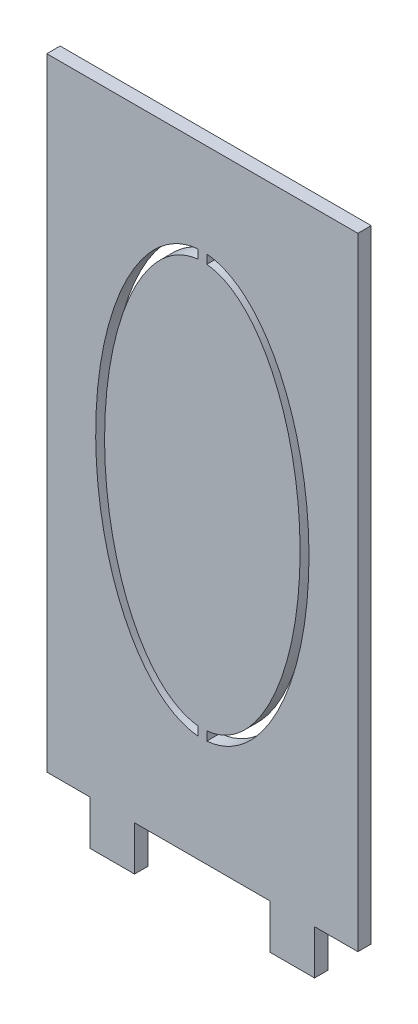
ISO-10303-21;
HEADER;
FILE_DESCRIPTION(('STEP AP214'),'2;1');
FILE_NAME('part.step','',(''),(''),'','','');
FILE_SCHEMA(('AUTOMOTIVE_DESIGN { 1 0 10303 214 1 1 1 1 }'));
ENDSEC;
DATA;
#1=APPLICATION_CONTEXT('core data for automotive mechanical design processes');
#2=APPLICATION_PROTOCOL_DEFINITION('international standard','automotive_design',2000,#1);
#3=PRODUCT_CONTEXT('',#1,'mechanical');
#4=PRODUCT('Part','Part','',(#3));
#5=PRODUCT_RELATED_PRODUCT_CATEGORY('part','',(#4));
#6=PRODUCT_DEFINITION_FORMATION('','',#4);
#7=PRODUCT_DEFINITION_CONTEXT('part definition',#1,'design');
#8=PRODUCT_DEFINITION('design','',#6,#7);
#9=PRODUCT_DEFINITION_SHAPE('','',#8);
#10=(LENGTH_UNIT() NAMED_UNIT(*) SI_UNIT(.MILLI.,.METRE.));
#11=(NAMED_UNIT(*) PLANE_ANGLE_UNIT() SI_UNIT($,.RADIAN.));
#12=(NAMED_UNIT(*) SI_UNIT($,.STERADIAN.) SOLID_ANGLE_UNIT());
#13=UNCERTAINTY_MEASURE_WITH_UNIT(LENGTH_MEASURE(1.E-05),#10,'distance_accuracy_value','');
#14=(GEOMETRIC_REPRESENTATION_CONTEXT(3) GLOBAL_UNCERTAINTY_ASSIGNED_CONTEXT((#13)) GLOBAL_UNIT_ASSIGNED_CONTEXT((#10,
#11,#12)) REPRESENTATION_CONTEXT('',''));
#15=CARTESIAN_POINT('',(0.,0.,0.));
#16=DIRECTION('',(0.,0.,1.));
#17=DIRECTION('',(1.,0.,0.));
#18=AXIS2_PLACEMENT_3D('',#15,#16,#17);
#19=CARTESIAN_POINT('',(17.,65.8133393669544,0.));
#20=DIRECTION('',(-1.,0.,0.));
#21=DIRECTION('',(0.,-1.,0.));
#22=AXIS2_PLACEMENT_3D('',#19,#20,#21);
#23=PLANE('',#22);
#24=DIRECTION('',(0.,0.,1.));
#25=VECTOR('',#24,1.);
#26=CARTESIAN_POINT('',(17.,18.0235142181697,0.750000000000001));
#27=LINE('',#26,#25);
#28=CARTESIAN_POINT('',(17.,18.0235142181697,0.));
#29=VERTEX_POINT('',#28);
#30=CARTESIAN_POINT('',(17.,18.0235142181697,1.5));
#31=VERTEX_POINT('',#30);
#32=EDGE_CURVE('E178',#29,#31,#27,.T.);
#33=ORIENTED_EDGE('',*,*,#32,.F.);
#34=DIRECTION('',(0.,-1.,0.));
#35=VECTOR('',#34,1.);
#36=CARTESIAN_POINT('',(17.,65.8133393669544,0.));
#37=LINE('',#36,#35);
#38=CARTESIAN_POINT('',(17.,17.0206252752756,0.));
#39=VERTEX_POINT('',#38);
#40=EDGE_CURVE('E204',#29,#39,#37,.T.);
#41=ORIENTED_EDGE('',*,*,#40,.T.);
#42=DIRECTION('',(0.,0.,1.));
#43=VECTOR('',#42,1.);
#44=CARTESIAN_POINT('',(17.,17.0206252752756,0.750000000000001));
#45=LINE('',#44,#43);
#46=CARTESIAN_POINT('',(17.,17.0206252752756,1.5));
#47=VERTEX_POINT('',#46);
#48=EDGE_CURVE('E354',#47,#39,#45,.F.);
#49=ORIENTED_EDGE('',*,*,#48,.F.);
#50=DIRECTION('',(0.,-1.,0.));
#51=VECTOR('',#50,1.);
#52=CARTESIAN_POINT('',(17.,65.8133393669544,1.5));
#53=LINE('',#52,#51);
#54=EDGE_CURVE('E196',#31,#47,#53,.T.);
#55=ORIENTED_EDGE('',*,*,#54,.F.);
#56=EDGE_LOOP('',(#33,#41,#49,#55));
#57=FACE_BOUND('',#56,.T.);
#58=ADVANCED_FACE('F39',(#57),#23,.T.);
#59=CARTESIAN_POINT('',(18.,65.8133393669544,0.));
#60=DIRECTION('',(1.,0.,0.));
#61=DIRECTION('',(0.,1.,0.));
#62=AXIS2_PLACEMENT_3D('',#59,#60,#61);
#63=PLANE('',#62);
#64=DIRECTION('',(0.,0.,1.));
#65=VECTOR('',#64,1.);
#66=CARTESIAN_POINT('',(18.,63.4764857818303,0.750000000000001));
#67=LINE('',#66,#65);
#68=CARTESIAN_POINT('',(18.,63.4764857818303,0.));
#69=VERTEX_POINT('',#68);
#70=CARTESIAN_POINT('',(18.,63.4764857818303,1.5));
#71=VERTEX_POINT('',#70);
#72=EDGE_CURVE('E11',#69,#71,#67,.T.);
#73=ORIENTED_EDGE('',*,*,#72,.F.);
#74=DIRECTION('',(0.,1.,0.));
#75=VECTOR('',#74,1.);
#76=CARTESIAN_POINT('',(18.,65.8133393669544,0.));
#77=LINE('',#76,#75);
#78=CARTESIAN_POINT('',(18.,64.4793747247244,0.));
#79=VERTEX_POINT('',#78);
#80=EDGE_CURVE('E351',#69,#79,#77,.T.);
#81=ORIENTED_EDGE('',*,*,#80,.T.);
#82=DIRECTION('',(0.,0.,1.));
#83=VECTOR('',#82,1.);
#84=CARTESIAN_POINT('',(18.,64.4793747247244,0.750000000000001));
#85=LINE('',#84,#83);
#86=CARTESIAN_POINT('',(18.,64.4793747247244,1.5));
#87=VERTEX_POINT('',#86);
#88=EDGE_CURVE('E359',#87,#79,#85,.F.);
#89=ORIENTED_EDGE('',*,*,#88,.F.);
#90=DIRECTION('',(0.,1.,0.));
#91=VECTOR('',#90,1.);
#92=CARTESIAN_POINT('',(18.,65.8133393669544,1.5));
#93=LINE('',#92,#91);
#94=EDGE_CURVE('E195',#71,#87,#93,.T.);
#95=ORIENTED_EDGE('',*,*,#94,.F.);
#96=EDGE_LOOP('',(#73,#81,#89,#95));
#97=FACE_BOUND('',#96,.T.);
#98=ADVANCED_FACE('F323',(#97),#63,.T.);
#99=CARTESIAN_POINT('',(17.5,40.75,-18.5));
#100=DIRECTION('',(0.,0.,1.));
#101=DIRECTION('',(0.,1.,0.));
#102=AXIS2_PLACEMENT_3D('',#99,#100,#101);
#103=ELLIPSE('',#102,23.75,12.);
#104=DIRECTION('',(0.,0.,1.));
#105=VECTOR('',#104,1.);
#106=SURFACE_OF_LINEAR_EXTRUSION('',#103,#105);
#107=CARTESIAN_POINT('',(17.5,40.75,1.5));
#108=DIRECTION('',(0.,0.,1.));
#109=DIRECTION('',(0.,1.,0.));
#110=AXIS2_PLACEMENT_3D('',#107,#108,#109);
#111=ELLIPSE('',#110,23.75,12.);
#112=CARTESIAN_POINT('',(17.,64.4793747247244,1.5));
#113=VERTEX_POINT('',#112);
#114=EDGE_CURVE('E193',#113,#47,#111,.T.);
#115=ORIENTED_EDGE('',*,*,#114,.T.);
#116=ORIENTED_EDGE('',*,*,#48,.T.);
#117=CARTESIAN_POINT('',(17.5,40.75,0.));
#118=DIRECTION('',(0.,0.,1.));
#119=DIRECTION('',(0.,1.,0.));
#120=AXIS2_PLACEMENT_3D('',#117,#118,#119);
#121=ELLIPSE('',#120,23.75,12.);
#122=CARTESIAN_POINT('',(17.,64.4793747247244,0.));
#123=VERTEX_POINT('',#122);
#124=EDGE_CURVE('E208',#39,#123,#121,.F.);
#125=ORIENTED_EDGE('',*,*,#124,.T.);
#126=DIRECTION('',(0.,0.,1.));
#127=VECTOR('',#126,1.);
#128=CARTESIAN_POINT('',(17.,64.4793747247244,0.750000000000001));
#129=LINE('',#128,#127);
#130=EDGE_CURVE('E357',#123,#113,#129,.T.);
#131=ORIENTED_EDGE('',*,*,#130,.T.);
#132=EDGE_LOOP('',(#115,#116,#125,#131));
#133=FACE_BOUND('',#132,.T.);
#134=ADVANCED_FACE('F305',(#133),#106,.F.);
#135=CARTESIAN_POINT('',(0.,0.,1.5));
#136=DIRECTION('',(0.,1.,0.));
#137=DIRECTION('',(0.,0.,1.));
#138=AXIS2_PLACEMENT_3D('',#135,#136,#137);
#139=PLANE('',#138);
#140=DIRECTION('',(1.,0.,0.));
#141=VECTOR('',#140,1.);
#142=CARTESIAN_POINT('',(0.,0.,1.5));
#143=LINE('',#142,#141);
#144=CARTESIAN_POINT('',(4.875,0.,1.5));
#145=VERTEX_POINT('',#144);
#146=CARTESIAN_POINT('',(9.875,0.,1.5));
#147=VERTEX_POINT('',#146);
#148=EDGE_CURVE('E242',#145,#147,#143,.T.);
#149=ORIENTED_EDGE('',*,*,#148,.F.);
#150=DIRECTION('',(0.,0.,1.));
#151=VECTOR('',#150,1.);
#152=CARTESIAN_POINT('',(4.875,0.,-18.5));
#153=LINE('',#152,#151);
#154=CARTESIAN_POINT('',(4.875,0.,0.));
#155=VERTEX_POINT('',#154);
#156=EDGE_CURVE('E211',#155,#145,#153,.T.);
#157=ORIENTED_EDGE('',*,*,#156,.F.);
#158=DIRECTION('',(1.,0.,0.));
#159=VECTOR('',#158,1.);
#160=CARTESIAN_POINT('',(0.,0.,0.));
#161=LINE('',#160,#159);
#162=CARTESIAN_POINT('',(9.875,0.,0.));
#163=VERTEX_POINT('',#162);
#164=EDGE_CURVE('E255',#155,#163,#161,.T.);
#165=ORIENTED_EDGE('',*,*,#164,.T.);
#166=DIRECTION('',(0.,0.,1.));
#167=VECTOR('',#166,1.);
#168=CARTESIAN_POINT('',(9.875,0.,-18.5));
#169=LINE('',#168,#167);
#170=EDGE_CURVE('E259',#163,#147,#169,.T.);
#171=ORIENTED_EDGE('',*,*,#170,.T.);
#172=EDGE_LOOP('',(#149,#157,#165,#171));
#173=FACE_BOUND('',#172,.T.);
#174=ADVANCED_FACE('F380',(#173),#139,.F.);
#175=CARTESIAN_POINT('',(0.,0.,1.5));
#176=DIRECTION('',(1.,0.,0.));
#177=DIRECTION('',(0.,1.,0.));
#178=AXIS2_PLACEMENT_3D('',#175,#176,#177);
#179=PLANE('',#178);
#180=DIRECTION('',(0.,-1.,0.));
#181=VECTOR('',#180,1.);
#182=CARTESIAN_POINT('',(0.,0.,0.));
#183=LINE('',#182,#181);
#184=CARTESIAN_POINT('',(0.,75.,0.));
#185=VERTEX_POINT('',#184);
#186=CARTESIAN_POINT('',(0.,5.,0.));
#187=VERTEX_POINT('',#186);
#188=EDGE_CURVE('E256',#185,#187,#183,.T.);
#189=ORIENTED_EDGE('',*,*,#188,.T.);
#190=DIRECTION('',(0.,0.,1.));
#191=VECTOR('',#190,1.);
#192=CARTESIAN_POINT('',(0.,5.,-18.5));
#193=LINE('',#192,#191);
#194=CARTESIAN_POINT('',(0.,5.,1.5));
#195=VERTEX_POINT('',#194);
#196=EDGE_CURVE('E248',#187,#195,#193,.T.);
#197=ORIENTED_EDGE('',*,*,#196,.T.);
#198=DIRECTION('',(0.,-1.,0.));
#199=VECTOR('',#198,1.);
#200=CARTESIAN_POINT('',(0.,0.,1.5));
#201=LINE('',#200,#199);
#202=CARTESIAN_POINT('',(0.,75.,1.5));
#203=VERTEX_POINT('',#202);
#204=EDGE_CURVE('E229',#203,#195,#201,.T.);
#205=ORIENTED_EDGE('',*,*,#204,.F.);
#206=DIRECTION('',(0.,0.,-1.));
#207=VECTOR('',#206,1.);
#208=CARTESIAN_POINT('',(0.,75.,1.5));
#209=LINE('',#208,#207);
#210=EDGE_CURVE('E244',#203,#185,#209,.T.);
#211=ORIENTED_EDGE('',*,*,#210,.T.);
#212=EDGE_LOOP('',(#189,#197,#205,#211));
#213=FACE_BOUND('',#212,.T.);
#214=ADVANCED_FACE('F401',(#213),#179,.F.);
#215=CARTESIAN_POINT('',(25.125,0.,0.));
#216=VERTEX_POINT('',#215);
#217=CARTESIAN_POINT('',(30.125,0.,0.));
#218=VERTEX_POINT('',#217);
#219=EDGE_CURVE('E247',#216,#218,#161,.T.);
#220=ORIENTED_EDGE('',*,*,#219,.T.);
#221=DIRECTION('',(0.,0.,1.));
#222=VECTOR('',#221,1.);
#223=CARTESIAN_POINT('',(30.125,0.,-18.5));
#224=LINE('',#223,#222);
#225=CARTESIAN_POINT('',(30.125,0.,1.5));
#226=VERTEX_POINT('',#225);
#227=EDGE_CURVE('E252',#218,#226,#224,.T.);
#228=ORIENTED_EDGE('',*,*,#227,.T.);
#229=CARTESIAN_POINT('',(25.125,0.,1.5));
#230=VERTEX_POINT('',#229);
#231=EDGE_CURVE('E264',#230,#226,#143,.T.);
#232=ORIENTED_EDGE('',*,*,#231,.F.);
#233=DIRECTION('',(0.,0.,1.));
#234=VECTOR('',#233,1.);
#235=CARTESIAN_POINT('',(25.125,0.,-18.5));
#236=LINE('',#235,#234);
#237=EDGE_CURVE('E237',#216,#230,#236,.T.);
#238=ORIENTED_EDGE('',*,*,#237,.F.);
#239=EDGE_LOOP('',(#220,#228,#232,#238));
#240=FACE_BOUND('',#239,.T.);
#241=ADVANCED_FACE('F421',(#240),#139,.F.);
#242=CARTESIAN_POINT('',(35.,0.,1.5));
#243=DIRECTION('',(-1.,0.,0.));
#244=DIRECTION('',(0.,-1.,0.));
#245=AXIS2_PLACEMENT_3D('',#242,#243,#244);
#246=PLANE('',#245);
#247=DIRECTION('',(0.,1.,0.));
#248=VECTOR('',#247,1.);
#249=CARTESIAN_POINT('',(35.,0.,1.5));
#250=LINE('',#249,#248);
#251=CARTESIAN_POINT('',(35.,5.,1.5));
#252=VERTEX_POINT('',#251);
#253=CARTESIAN_POINT('',(35.,75.,1.5));
#254=VERTEX_POINT('',#253);
#255=EDGE_CURVE('E262',#252,#254,#250,.T.);
#256=ORIENTED_EDGE('',*,*,#255,.F.);
#257=DIRECTION('',(0.,0.,1.));
#258=VECTOR('',#257,1.);
#259=CARTESIAN_POINT('',(35.,5.,-18.5));
#260=LINE('',#259,#258);
#261=CARTESIAN_POINT('',(35.,5.,0.));
#262=VERTEX_POINT('',#261);
#263=EDGE_CURVE('E224',#262,#252,#260,.T.);
#264=ORIENTED_EDGE('',*,*,#263,.F.);
#265=DIRECTION('',(0.,1.,0.));
#266=VECTOR('',#265,1.);
#267=CARTESIAN_POINT('',(35.,0.,0.));
#268=LINE('',#267,#266);
#269=CARTESIAN_POINT('',(35.,75.,0.));
#270=VERTEX_POINT('',#269);
#271=EDGE_CURVE('E250',#262,#270,#268,.T.);
#272=ORIENTED_EDGE('',*,*,#271,.T.);
#273=DIRECTION('',(0.,0.,-1.));
#274=VECTOR('',#273,1.);
#275=CARTESIAN_POINT('',(35.,75.,1.5));
#276=LINE('',#275,#274);
#277=EDGE_CURVE('E239',#254,#270,#276,.T.);
#278=ORIENTED_EDGE('',*,*,#277,.F.);
#279=EDGE_LOOP('',(#256,#264,#272,#278));
#280=FACE_BOUND('',#279,.T.);
#281=ADVANCED_FACE('F413',(#280),#246,.F.);
#282=CARTESIAN_POINT('',(0.,75.,1.5));
#283=DIRECTION('',(0.,-1.,0.));
#284=DIRECTION('',(0.,0.,-1.));
#285=AXIS2_PLACEMENT_3D('',#282,#283,#284);
#286=PLANE('',#285);
#287=DIRECTION('',(-1.,0.,0.));
#288=VECTOR('',#287,1.);
#289=CARTESIAN_POINT('',(0.,75.,0.));
#290=LINE('',#289,#288);
#291=EDGE_CURVE('E243',#270,#185,#290,.T.);
#292=ORIENTED_EDGE('',*,*,#291,.T.);
#293=ORIENTED_EDGE('',*,*,#210,.F.);
#294=DIRECTION('',(-1.,0.,0.));
#295=VECTOR('',#294,1.);
#296=CARTESIAN_POINT('',(0.,75.,1.5));
#297=LINE('',#296,#295);
#298=EDGE_CURVE('E260',#254,#203,#297,.T.);
#299=ORIENTED_EDGE('',*,*,#298,.F.);
#300=ORIENTED_EDGE('',*,*,#277,.T.);
#301=EDGE_LOOP('',(#292,#293,#299,#300));
#302=FACE_BOUND('',#301,.T.);
#303=ADVANCED_FACE('F319',(#302),#286,.F.);
#304=CARTESIAN_POINT('',(0.,0.,1.5));
#305=DIRECTION('',(0.,0.,-1.));
#306=DIRECTION('',(-1.,0.,0.));
#307=AXIS2_PLACEMENT_3D('',#304,#305,#306);
#308=PLANE('',#307);
#309=CARTESIAN_POINT('',(17.5,40.75,1.5));
#310=DIRECTION('',(0.,0.,1.));
#311=DIRECTION('',(0.,1.,0.));
#312=AXIS2_PLACEMENT_3D('',#309,#310,#311);
#313=ELLIPSE('',#312,22.75,11.);
#314=CARTESIAN_POINT('',(17.,63.4764857818303,1.5));
#315=VERTEX_POINT('',#314);
#316=EDGE_CURVE('E54',#315,#31,#313,.T.);
#317=ORIENTED_EDGE('',*,*,#316,.T.);
#318=ORIENTED_EDGE('',*,*,#54,.T.);
#319=ORIENTED_EDGE('',*,*,#114,.F.);
#320=EDGE_CURVE('E187',#113,#315,#53,.T.);
#321=ORIENTED_EDGE('',*,*,#320,.T.);
#322=EDGE_LOOP('',(#317,#318,#319,#321));
#323=FACE_BOUND('',#322,.T.);
#324=CARTESIAN_POINT('',(18.,17.0206252752756,1.5));
#325=VERTEX_POINT('',#324);
#326=CARTESIAN_POINT('',(18.,18.0235142181697,1.5));
#327=VERTEX_POINT('',#326);
#328=EDGE_CURVE('E198',#325,#327,#93,.T.);
#329=ORIENTED_EDGE('',*,*,#328,.T.);
#330=EDGE_CURVE('E62',#327,#71,#313,.T.);
#331=ORIENTED_EDGE('',*,*,#330,.T.);
#332=ORIENTED_EDGE('',*,*,#94,.T.);
#333=EDGE_CURVE('E207',#325,#87,#111,.T.);
#334=ORIENTED_EDGE('',*,*,#333,.F.);
#335=EDGE_LOOP('',(#329,#331,#332,#334));
#336=FACE_BOUND('',#335,.T.);
#337=DIRECTION('',(-1.,0.,0.));
#338=VECTOR('',#337,1.);
#339=CARTESIAN_POINT('',(4.875,5.,1.5));
#340=LINE('',#339,#338);
#341=CARTESIAN_POINT('',(4.875,5.,1.5));
#342=VERTEX_POINT('',#341);
#343=EDGE_CURVE('E280',#342,#195,#340,.T.);
#344=ORIENTED_EDGE('',*,*,#343,.F.);
#345=DIRECTION('',(0.,1.,0.));
#346=VECTOR('',#345,1.);
#347=CARTESIAN_POINT('',(4.875,5.,1.5));
#348=LINE('',#347,#346);
#349=EDGE_CURVE('E216',#145,#342,#348,.T.);
#350=ORIENTED_EDGE('',*,*,#349,.F.);
#351=ORIENTED_EDGE('',*,*,#148,.T.);
#352=DIRECTION('',(0.,-1.,0.));
#353=VECTOR('',#352,1.);
#354=CARTESIAN_POINT('',(9.875,0.,1.5));
#355=LINE('',#354,#353);
#356=CARTESIAN_POINT('',(9.875,5.,1.5));
#357=VERTEX_POINT('',#356);
#358=EDGE_CURVE('E234',#357,#147,#355,.T.);
#359=ORIENTED_EDGE('',*,*,#358,.F.);
#360=DIRECTION('',(-1.,0.,0.));
#361=VECTOR('',#360,1.);
#362=CARTESIAN_POINT('',(9.875,5.,1.5));
#363=LINE('',#362,#361);
#364=CARTESIAN_POINT('',(25.125,5.,1.5));
#365=VERTEX_POINT('',#364);
#366=EDGE_CURVE('E238',#365,#357,#363,.T.);
#367=ORIENTED_EDGE('',*,*,#366,.F.);
#368=DIRECTION('',(0.,1.,0.));
#369=VECTOR('',#368,1.);
#370=CARTESIAN_POINT('',(25.125,0.,1.5));
#371=LINE('',#370,#369);
#372=EDGE_CURVE('E221',#230,#365,#371,.T.);
#373=ORIENTED_EDGE('',*,*,#372,.F.);
#374=ORIENTED_EDGE('',*,*,#231,.T.);
#375=DIRECTION('',(0.,-1.,0.));
#376=VECTOR('',#375,1.);
#377=CARTESIAN_POINT('',(30.125,5.,1.5));
#378=LINE('',#377,#376);
#379=CARTESIAN_POINT('',(30.125,5.,1.5));
#380=VERTEX_POINT('',#379);
#381=EDGE_CURVE('E225',#380,#226,#378,.T.);
#382=ORIENTED_EDGE('',*,*,#381,.F.);
#383=DIRECTION('',(-1.,0.,0.));
#384=VECTOR('',#383,1.);
#385=CARTESIAN_POINT('',(30.125,5.,1.5));
#386=LINE('',#385,#384);
#387=EDGE_CURVE('E212',#252,#380,#386,.T.);
#388=ORIENTED_EDGE('',*,*,#387,.F.);
#389=ORIENTED_EDGE('',*,*,#255,.T.);
#390=ORIENTED_EDGE('',*,*,#298,.T.);
#391=ORIENTED_EDGE('',*,*,#204,.T.);
#392=EDGE_LOOP('',(#344,#350,#351,#359,#367,#373,#374,#382,#388,#389,#390,#391));
#393=FACE_BOUND('',#392,.T.);
#394=ADVANCED_FACE('F41',(#323,#336,#393),#308,.F.);
#395=CARTESIAN_POINT('',(0.,0.,0.));
#396=DIRECTION('',(0.,0.,-1.));
#397=DIRECTION('',(-1.,0.,0.));
#398=AXIS2_PLACEMENT_3D('',#395,#396,#397);
#399=PLANE('',#398);
#400=ORIENTED_EDGE('',*,*,#40,.F.);
#401=CARTESIAN_POINT('',(17.5,40.75,0.));
#402=DIRECTION('',(0.,0.,1.));
#403=DIRECTION('',(0.,1.,0.));
#404=AXIS2_PLACEMENT_3D('',#401,#402,#403);
#405=ELLIPSE('',#404,22.75,11.);
#406=CARTESIAN_POINT('',(17.,63.4764857818303,0.));
#407=VERTEX_POINT('',#406);
#408=EDGE_CURVE('E180',#29,#407,#405,.F.);
#409=ORIENTED_EDGE('',*,*,#408,.T.);
#410=EDGE_CURVE('E189',#123,#407,#37,.T.);
#411=ORIENTED_EDGE('',*,*,#410,.F.);
#412=ORIENTED_EDGE('',*,*,#124,.F.);
#413=EDGE_LOOP('',(#400,#409,#411,#412));
#414=FACE_BOUND('',#413,.T.);
#415=CARTESIAN_POINT('',(18.,18.0235142181697,0.));
#416=VERTEX_POINT('',#415);
#417=EDGE_CURVE('E190',#69,#416,#405,.F.);
#418=ORIENTED_EDGE('',*,*,#417,.T.);
#419=CARTESIAN_POINT('',(18.,17.0206252752756,0.));
#420=VERTEX_POINT('',#419);
#421=EDGE_CURVE('E201',#420,#416,#77,.T.);
#422=ORIENTED_EDGE('',*,*,#421,.F.);
#423=EDGE_CURVE('E205',#79,#420,#121,.F.);
#424=ORIENTED_EDGE('',*,*,#423,.F.);
#425=ORIENTED_EDGE('',*,*,#80,.F.);
#426=EDGE_LOOP('',(#418,#422,#424,#425));
#427=FACE_BOUND('',#426,.T.);
#428=DIRECTION('',(0.,-1.,0.));
#429=VECTOR('',#428,1.);
#430=CARTESIAN_POINT('',(4.875,0.,0.));
#431=LINE('',#430,#429);
#432=CARTESIAN_POINT('',(4.875,5.,0.));
#433=VERTEX_POINT('',#432);
#434=EDGE_CURVE('E209',#433,#155,#431,.T.);
#435=ORIENTED_EDGE('',*,*,#434,.F.);
#436=DIRECTION('',(1.,0.,0.));
#437=VECTOR('',#436,1.);
#438=CARTESIAN_POINT('',(0.,5.,0.));
#439=LINE('',#438,#437);
#440=EDGE_CURVE('E213',#187,#433,#439,.T.);
#441=ORIENTED_EDGE('',*,*,#440,.F.);
#442=ORIENTED_EDGE('',*,*,#188,.F.);
#443=ORIENTED_EDGE('',*,*,#291,.F.);
#444=ORIENTED_EDGE('',*,*,#271,.F.);
#445=DIRECTION('',(1.,0.,0.));
#446=VECTOR('',#445,1.);
#447=CARTESIAN_POINT('',(0.,5.,0.));
#448=LINE('',#447,#446);
#449=CARTESIAN_POINT('',(30.125,5.,0.));
#450=VERTEX_POINT('',#449);
#451=EDGE_CURVE('E222',#450,#262,#448,.T.);
#452=ORIENTED_EDGE('',*,*,#451,.F.);
#453=DIRECTION('',(0.,1.,0.));
#454=VECTOR('',#453,1.);
#455=CARTESIAN_POINT('',(30.125,0.,0.));
#456=LINE('',#455,#454);
#457=EDGE_CURVE('E217',#218,#450,#456,.T.);
#458=ORIENTED_EDGE('',*,*,#457,.F.);
#459=ORIENTED_EDGE('',*,*,#219,.F.);
#460=DIRECTION('',(0.,-1.,0.));
#461=VECTOR('',#460,1.);
#462=CARTESIAN_POINT('',(25.125,0.,0.));
#463=LINE('',#462,#461);
#464=CARTESIAN_POINT('',(25.125,5.,0.));
#465=VERTEX_POINT('',#464);
#466=EDGE_CURVE('E235',#465,#216,#463,.T.);
#467=ORIENTED_EDGE('',*,*,#466,.F.);
#468=DIRECTION('',(1.,0.,0.));
#469=VECTOR('',#468,1.);
#470=CARTESIAN_POINT('',(0.,5.,0.));
#471=LINE('',#470,#469);
#472=CARTESIAN_POINT('',(9.875,5.,0.));
#473=VERTEX_POINT('',#472);
#474=EDGE_CURVE('E230',#473,#465,#471,.T.);
#475=ORIENTED_EDGE('',*,*,#474,.F.);
#476=DIRECTION('',(0.,1.,0.));
#477=VECTOR('',#476,1.);
#478=CARTESIAN_POINT('',(9.875,0.,0.));
#479=LINE('',#478,#477);
#480=EDGE_CURVE('E226',#163,#473,#479,.T.);
#481=ORIENTED_EDGE('',*,*,#480,.F.);
#482=ORIENTED_EDGE('',*,*,#164,.F.);
#483=EDGE_LOOP('',(#435,#441,#442,#443,#444,#452,#458,#459,#467,#475,#481,#482));
#484=FACE_BOUND('',#483,.T.);
#485=ADVANCED_FACE('F308',(#414,#427,#484),#399,.T.);
#486=CARTESIAN_POINT('',(9.875,0.,-18.5));
#487=DIRECTION('',(-1.,0.,0.));
#488=DIRECTION('',(0.,-1.,0.));
#489=AXIS2_PLACEMENT_3D('',#486,#487,#488);
#490=PLANE('',#489);
#491=ORIENTED_EDGE('',*,*,#480,.T.);
#492=DIRECTION('',(0.,0.,1.));
#493=VECTOR('',#492,1.);
#494=CARTESIAN_POINT('',(9.875,5.,-18.5));
#495=LINE('',#494,#493);
#496=EDGE_CURVE('E228',#473,#357,#495,.T.);
#497=ORIENTED_EDGE('',*,*,#496,.T.);
#498=ORIENTED_EDGE('',*,*,#358,.T.);
#499=ORIENTED_EDGE('',*,*,#170,.F.);
#500=EDGE_LOOP('',(#491,#497,#498,#499));
#501=FACE_BOUND('',#500,.T.);
#502=ADVANCED_FACE('F310',(#501),#490,.F.);
#503=CARTESIAN_POINT('',(9.875,5.,-18.5));
#504=DIRECTION('',(0.,1.,0.));
#505=DIRECTION('',(0.,0.,1.));
#506=AXIS2_PLACEMENT_3D('',#503,#504,#505);
#507=PLANE('',#506);
#508=ORIENTED_EDGE('',*,*,#474,.T.);
#509=DIRECTION('',(0.,0.,1.));
#510=VECTOR('',#509,1.);
#511=CARTESIAN_POINT('',(25.125,5.,-18.5));
#512=LINE('',#511,#510);
#513=EDGE_CURVE('E233',#465,#365,#512,.T.);
#514=ORIENTED_EDGE('',*,*,#513,.T.);
#515=ORIENTED_EDGE('',*,*,#366,.T.);
#516=ORIENTED_EDGE('',*,*,#496,.F.);
#517=EDGE_LOOP('',(#508,#514,#515,#516));
#518=FACE_BOUND('',#517,.T.);
#519=ADVANCED_FACE('F316',(#518),#507,.F.);
#520=CARTESIAN_POINT('',(25.125,0.,-18.5));
#521=DIRECTION('',(1.,0.,0.));
#522=DIRECTION('',(0.,0.,-1.));
#523=AXIS2_PLACEMENT_3D('',#520,#521,#522);
#524=PLANE('',#523);
#525=ORIENTED_EDGE('',*,*,#466,.T.);
#526=ORIENTED_EDGE('',*,*,#237,.T.);
#527=ORIENTED_EDGE('',*,*,#372,.T.);
#528=ORIENTED_EDGE('',*,*,#513,.F.);
#529=EDGE_LOOP('',(#525,#526,#527,#528));
#530=FACE_BOUND('',#529,.T.);
#531=ADVANCED_FACE('F425',(#530),#524,.F.);
#532=CARTESIAN_POINT('',(30.125,5.,-18.5));
#533=DIRECTION('',(-1.,0.,0.));
#534=DIRECTION('',(0.,0.,1.));
#535=AXIS2_PLACEMENT_3D('',#532,#533,#534);
#536=PLANE('',#535);
#537=ORIENTED_EDGE('',*,*,#457,.T.);
#538=DIRECTION('',(0.,0.,1.));
#539=VECTOR('',#538,1.);
#540=CARTESIAN_POINT('',(30.125,5.,-18.5));
#541=LINE('',#540,#539);
#542=EDGE_CURVE('E220',#450,#380,#541,.T.);
#543=ORIENTED_EDGE('',*,*,#542,.T.);
#544=ORIENTED_EDGE('',*,*,#381,.T.);
#545=ORIENTED_EDGE('',*,*,#227,.F.);
#546=EDGE_LOOP('',(#537,#543,#544,#545));
#547=FACE_BOUND('',#546,.T.);
#548=ADVANCED_FACE('F419',(#547),#536,.F.);
#549=CARTESIAN_POINT('',(30.125,5.,-18.5));
#550=DIRECTION('',(0.,1.,0.));
#551=DIRECTION('',(0.,0.,1.));
#552=AXIS2_PLACEMENT_3D('',#549,#550,#551);
#553=PLANE('',#552);
#554=ORIENTED_EDGE('',*,*,#451,.T.);
#555=ORIENTED_EDGE('',*,*,#263,.T.);
#556=ORIENTED_EDGE('',*,*,#387,.T.);
#557=ORIENTED_EDGE('',*,*,#542,.F.);
#558=EDGE_LOOP('',(#554,#555,#556,#557));
#559=FACE_BOUND('',#558,.T.);
#560=ADVANCED_FACE('F306',(#559),#553,.F.);
#561=CARTESIAN_POINT('',(4.875,5.,-18.5));
#562=DIRECTION('',(1.,0.,0.));
#563=DIRECTION('',(0.,1.,0.));
#564=AXIS2_PLACEMENT_3D('',#561,#562,#563);
#565=PLANE('',#564);
#566=ORIENTED_EDGE('',*,*,#434,.T.);
#567=ORIENTED_EDGE('',*,*,#156,.T.);
#568=ORIENTED_EDGE('',*,*,#349,.T.);
#569=DIRECTION('',(0.,0.,1.));
#570=VECTOR('',#569,1.);
#571=CARTESIAN_POINT('',(4.875,5.,-18.5));
#572=LINE('',#571,#570);
#573=EDGE_CURVE('E215',#433,#342,#572,.T.);
#574=ORIENTED_EDGE('',*,*,#573,.F.);
#575=EDGE_LOOP('',(#566,#567,#568,#574));
#576=FACE_BOUND('',#575,.T.);
#577=ADVANCED_FACE('F396',(#576),#565,.F.);
#578=CARTESIAN_POINT('',(4.875,5.,-18.5));
#579=DIRECTION('',(0.,1.,0.));
#580=DIRECTION('',(-1.,0.,0.));
#581=AXIS2_PLACEMENT_3D('',#578,#579,#580);
#582=PLANE('',#581);
#583=ORIENTED_EDGE('',*,*,#440,.T.);
#584=ORIENTED_EDGE('',*,*,#573,.T.);
#585=ORIENTED_EDGE('',*,*,#343,.T.);
#586=ORIENTED_EDGE('',*,*,#196,.F.);
#587=EDGE_LOOP('',(#583,#584,#585,#586));
#588=FACE_BOUND('',#587,.T.);
#589=ADVANCED_FACE('F303',(#588),#582,.F.);
#590=ORIENTED_EDGE('',*,*,#333,.T.);
#591=ORIENTED_EDGE('',*,*,#88,.T.);
#592=ORIENTED_EDGE('',*,*,#423,.T.);
#593=DIRECTION('',(0.,0.,1.));
#594=VECTOR('',#593,1.);
#595=CARTESIAN_POINT('',(18.,17.0206252752756,0.750000000000001));
#596=LINE('',#595,#594);
#597=EDGE_CURVE('E295',#420,#325,#596,.T.);
#598=ORIENTED_EDGE('',*,*,#597,.T.);
#599=EDGE_LOOP('',(#590,#591,#592,#598));
#600=FACE_BOUND('',#599,.T.);
#601=ADVANCED_FACE('F300',(#600),#106,.F.);
#602=DIRECTION('',(0.,0.,1.));
#603=VECTOR('',#602,1.);
#604=CARTESIAN_POINT('',(17.,63.4764857818303,0.750000000000001));
#605=LINE('',#604,#603);
#606=EDGE_CURVE('E175',#315,#407,#605,.F.);
#607=ORIENTED_EDGE('',*,*,#606,.F.);
#608=ORIENTED_EDGE('',*,*,#320,.F.);
#609=ORIENTED_EDGE('',*,*,#130,.F.);
#610=ORIENTED_EDGE('',*,*,#410,.T.);
#611=EDGE_LOOP('',(#607,#608,#609,#610));
#612=FACE_BOUND('',#611,.T.);
#613=ADVANCED_FACE('F185',(#612),#23,.T.);
#614=DIRECTION('',(0.,0.,1.));
#615=VECTOR('',#614,1.);
#616=CARTESIAN_POINT('',(18.,18.0235142181697,0.750000000000001));
#617=LINE('',#616,#615);
#618=EDGE_CURVE('E47',#327,#416,#617,.F.);
#619=ORIENTED_EDGE('',*,*,#618,.F.);
#620=ORIENTED_EDGE('',*,*,#328,.F.);
#621=ORIENTED_EDGE('',*,*,#597,.F.);
#622=ORIENTED_EDGE('',*,*,#421,.T.);
#623=EDGE_LOOP('',(#619,#620,#621,#622));
#624=FACE_BOUND('',#623,.T.);
#625=ADVANCED_FACE('F332',(#624),#63,.T.);
#626=CARTESIAN_POINT('',(17.5,40.75,-18.5));
#627=DIRECTION('',(0.,0.,1.));
#628=DIRECTION('',(0.,1.,0.));
#629=AXIS2_PLACEMENT_3D('',#626,#627,#628);
#630=ELLIPSE('',#629,22.75,11.);
#631=DIRECTION('',(0.,0.,1.));
#632=VECTOR('',#631,1.);
#633=SURFACE_OF_LINEAR_EXTRUSION('',#630,#632);
#634=ORIENTED_EDGE('',*,*,#417,.F.);
#635=ORIENTED_EDGE('',*,*,#72,.T.);
#636=ORIENTED_EDGE('',*,*,#330,.F.);
#637=ORIENTED_EDGE('',*,*,#618,.T.);
#638=EDGE_LOOP('',(#634,#635,#636,#637));
#639=FACE_BOUND('',#638,.T.);
#640=ADVANCED_FACE('F338',(#639),#633,.T.);
#641=ORIENTED_EDGE('',*,*,#408,.F.);
#642=ORIENTED_EDGE('',*,*,#32,.T.);
#643=ORIENTED_EDGE('',*,*,#316,.F.);
#644=ORIENTED_EDGE('',*,*,#606,.T.);
#645=EDGE_LOOP('',(#641,#642,#643,#644));
#646=FACE_BOUND('',#645,.T.);
#647=ADVANCED_FACE('F174',(#646),#633,.T.);
#648=CLOSED_SHELL('',(#58,#98,#134,#174,#214,#241,#281,#303,#394,#485,#502,#519,#531,#548,#560,
#577,#589,#601,#613,#625,#640,#647));
#649=MANIFOLD_SOLID_BREP('B2',#648);
#650=ADVANCED_BREP_SHAPE_REPRESENTATION('',(#18,#649),#14);
#651=SHAPE_DEFINITION_REPRESENTATION(#9,#650);
ENDSEC;
END-ISO-10303-21;
